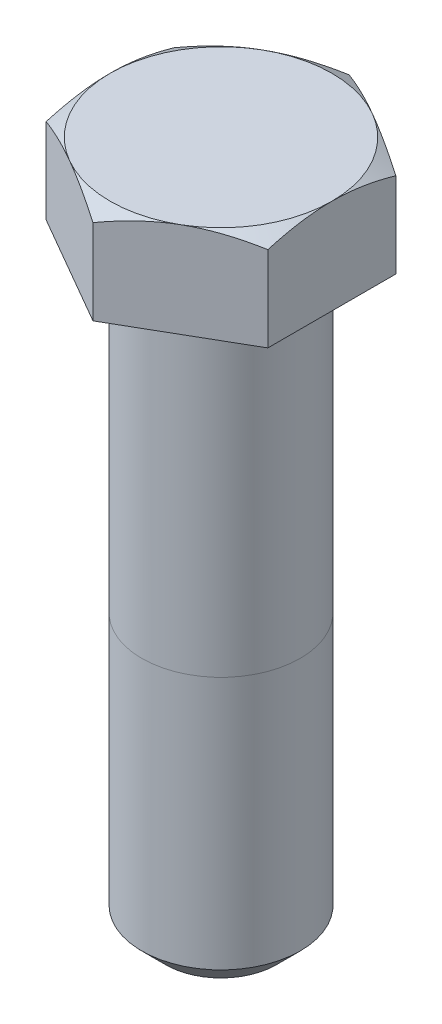
ISO-10303-21;
HEADER;
FILE_DESCRIPTION(('STEP AP214'),'2;1');
FILE_NAME('part.step','',(''),(''),'','','');
FILE_SCHEMA(('AUTOMOTIVE_DESIGN { 1 0 10303 214 1 1 1 1 }'));
ENDSEC;
DATA;
#1=APPLICATION_CONTEXT('core data for automotive mechanical design processes');
#2=APPLICATION_PROTOCOL_DEFINITION('international standard','automotive_design',2000,#1);
#3=PRODUCT_CONTEXT('',#1,'mechanical');
#4=PRODUCT('Part','Part','',(#3));
#5=PRODUCT_RELATED_PRODUCT_CATEGORY('part','',(#4));
#6=PRODUCT_DEFINITION_FORMATION('','',#4);
#7=PRODUCT_DEFINITION_CONTEXT('part definition',#1,'design');
#8=PRODUCT_DEFINITION('design','',#6,#7);
#9=PRODUCT_DEFINITION_SHAPE('','',#8);
#10=(LENGTH_UNIT() NAMED_UNIT(*) SI_UNIT(.MILLI.,.METRE.));
#11=(NAMED_UNIT(*) PLANE_ANGLE_UNIT() SI_UNIT($,.RADIAN.));
#12=(NAMED_UNIT(*) SI_UNIT($,.STERADIAN.) SOLID_ANGLE_UNIT());
#13=UNCERTAINTY_MEASURE_WITH_UNIT(LENGTH_MEASURE(1.E-05),#10,'distance_accuracy_value','');
#14=(GEOMETRIC_REPRESENTATION_CONTEXT(3) GLOBAL_UNCERTAINTY_ASSIGNED_CONTEXT((#13)) GLOBAL_UNIT_ASSIGNED_CONTEXT((#10,
#11,#12)) REPRESENTATION_CONTEXT('',''));
#15=CARTESIAN_POINT('',(0.,0.,0.));
#16=DIRECTION('',(0.,0.,1.));
#17=DIRECTION('',(1.,0.,0.));
#18=AXIS2_PLACEMENT_3D('',#15,#16,#17);
#19=CARTESIAN_POINT('',(0.,-75.,0.));
#20=DIRECTION('',(0.,1.,0.));
#21=DIRECTION('',(0.,0.,1.));
#22=AXIS2_PLACEMENT_3D('',#19,#20,#21);
#23=CYLINDRICAL_SURFACE('',#22,10.);
#24=CARTESIAN_POINT('',(0.,-72.,0.));
#25=DIRECTION('',(0.,-1.,0.));
#26=DIRECTION('',(0.,0.,-1.));
#27=AXIS2_PLACEMENT_3D('',#24,#25,#26);
#28=CIRCLE('',#27,10.);
#29=CARTESIAN_POINT('',(0.,-72.,-10.));
#30=VERTEX_POINT('',#29);
#31=EDGE_CURVE('E272',#30,#30,#28,.F.);
#32=ORIENTED_EDGE('',*,*,#31,.T.);
#33=EDGE_LOOP('',(#32));
#34=FACE_BOUND('',#33,.T.);
#35=CARTESIAN_POINT('',(0.,-40.,0.));
#36=DIRECTION('',(0.,1.,0.));
#37=DIRECTION('',(0.,0.,1.));
#38=AXIS2_PLACEMENT_3D('',#35,#36,#37);
#39=CIRCLE('',#38,10.);
#40=CARTESIAN_POINT('',(10.,-40.,0.));
#41=VERTEX_POINT('',#40);
#42=CARTESIAN_POINT('',(-10.,-40.,0.));
#43=VERTEX_POINT('',#42);
#44=EDGE_CURVE('E12',#41,#43,#39,.T.);
#45=ORIENTED_EDGE('',*,*,#44,.F.);
#46=EDGE_CURVE('E62',#43,#41,#39,.T.);
#47=ORIENTED_EDGE('',*,*,#46,.F.);
#48=EDGE_LOOP('',(#45,#47));
#49=FACE_BOUND('',#48,.T.);
#50=ADVANCED_FACE('F57',(#34,#49),#23,.T.);
#51=CARTESIAN_POINT('',(-13.9999999999999,12.,8.08290376865491));
#52=DIRECTION('',(0.499999999999995,0.,-0.866025403784441));
#53=DIRECTION('',(-0.866025403784441,0.,-0.499999999999995));
#54=AXIS2_PLACEMENT_3D('',#51,#52,#53);
#55=PLANE('',#54);
#56=CARTESIAN_POINT('',(-14.0001999999999,10.7495037679405,8.08278829860107));
#57=CARTESIAN_POINT('',(-13.692485390418,10.8520687355186,8.26044741127677));
#58=CARTESIAN_POINT('',(-13.3835705284392,10.9499795109551,8.43879948999691));
#59=CARTESIAN_POINT('',(-12.7632636692858,11.1351989694353,8.79693382210926));
#60=CARTESIAN_POINT('',(-12.4518708930621,11.2225041654761,8.97671652528571));
#61=CARTESIAN_POINT('',(-11.8260063991706,11.3853389062415,9.33805955931021));
#62=CARTESIAN_POINT('',(-11.5115292047328,11.4608405894043,9.5196230521729));
#63=CARTESIAN_POINT('',(-10.8803895759988,11.5984470625897,9.88401168671867));
#64=CARTESIAN_POINT('',(-10.5637272674324,11.6605526168897,10.0668367558117));
#65=CARTESIAN_POINT('',(-9.93633151674906,11.7687252680104,10.4290638613571));
#66=CARTESIAN_POINT('',(-9.6256446532553,11.81515039644,10.6084390056289));
#67=CARTESIAN_POINT('',(-9.00284729327501,11.8929951265451,10.9680112290642));
#68=CARTESIAN_POINT('',(-8.69073676950305,11.9244144393938,11.1482083239808));
#69=CARTESIAN_POINT('',(-8.0659914147665,11.9714542186344,11.5089052227129));
#70=CARTESIAN_POINT('',(-7.75335765114491,11.9870934589966,11.6894044102976));
#71=CARTESIAN_POINT('',(-7.12780152662083,12.0022367596143,12.0505694071848));
#72=CARTESIAN_POINT('',(-6.8148791749344,12.0017413184259,12.2312352111664));
#73=CARTESIAN_POINT('',(-6.22987230119091,11.9857422399056,12.5689890872));
#74=CARTESIAN_POINT('',(-5.95774609067852,11.9721901053227,12.7261012280929));
#75=CARTESIAN_POINT('',(-5.41411962233179,11.9331392398875,13.0399641159314));
#76=CARTESIAN_POINT('',(-5.14261941013841,11.9076396640127,13.1967148365263));
#77=CARTESIAN_POINT('',(-4.60039240839658,11.8451385190432,13.5097697419439));
#78=CARTESIAN_POINT('',(-4.32966644468913,11.8081274502385,13.666073449967));
#79=CARTESIAN_POINT('',(-3.78948373337585,11.7232526731859,13.9779480837553));
#80=CARTESIAN_POINT('',(-3.52002707332621,11.6753882271492,14.1335189589699));
#81=CARTESIAN_POINT('',(-2.70207638818779,11.514304872236,14.6057630072184));
#82=CARTESIAN_POINT('',(-2.15595101855748,11.3850242516312,14.9210686363857));
#83=CARTESIAN_POINT('',(-1.07184369066129,11.0916100987947,15.546978293977));
#84=CARTESIAN_POINT('',(-0.533847852112646,10.9275454762133,15.857590336186));
#85=CARTESIAN_POINT('',(0.000199999999999706,10.7495037679405,16.1659230073633));
#86=B_SPLINE_CURVE_WITH_KNOTS('',3,(#56,#57,#58,#59,#60,#61,#62,#63,#64,#65,#66,#67,#68,#69,#70,
#71,#72,#73,#74,#75,#76,#77,#78,#79,#80,#81,#82,#83,#84,#85),.UNSPECIFIED.,.F.,.F.,(4,2,2,2,2,2,
2,2,2,2,2,2,2,2,4),(0.,1.10950436744395,2.21937254652006,3.33182219257024,4.44420835421648,
5.52913815688044,6.61408884107339,7.69774720328184,8.7813720808532,9.72469383358148,
10.6680823159393,11.6122513923123,12.5564846704802,14.4864746839189,16.4126763879158),.UNSPECIFIED.);
#87=CARTESIAN_POINT('',(-13.9999999999999,10.7495704353215,8.08290376865495));
#88=VERTEX_POINT('',#87);
#89=CARTESIAN_POINT('',(-6.99999999999994,12.,12.1243556529822));
#90=VERTEX_POINT('',#89);
#91=EDGE_CURVE('E146',#88,#90,#86,.T.);
#92=ORIENTED_EDGE('',*,*,#91,.F.);
#93=DIRECTION('',(0.,-1.,0.));
#94=VECTOR('',#93,1.);
#95=CARTESIAN_POINT('',(-13.9999999999999,12.,8.08290376865491));
#96=LINE('',#95,#94);
#97=CARTESIAN_POINT('',(-13.9999999999999,0.,8.08290376865491));
#98=VERTEX_POINT('',#97);
#99=EDGE_CURVE('E291',#88,#98,#96,.T.);
#100=ORIENTED_EDGE('',*,*,#99,.T.);
#101=DIRECTION('',(0.866025403784441,0.,0.499999999999995));
#102=VECTOR('',#101,1.);
#103=CARTESIAN_POINT('',(-13.9999999999999,0.,8.08290376865491));
#104=LINE('',#103,#102);
#105=CARTESIAN_POINT('',(0.,0.,16.1658075373095));
#106=VERTEX_POINT('',#105);
#107=EDGE_CURVE('E154',#98,#106,#104,.T.);
#108=ORIENTED_EDGE('',*,*,#107,.T.);
#109=DIRECTION('',(0.,-1.,0.));
#110=VECTOR('',#109,1.);
#111=CARTESIAN_POINT('',(0.,12.,16.1658075373095));
#112=LINE('',#111,#110);
#113=CARTESIAN_POINT('',(0.,10.7495704353215,16.1658075373095));
#114=VERTEX_POINT('',#113);
#115=EDGE_CURVE('E159',#114,#106,#112,.T.);
#116=ORIENTED_EDGE('',*,*,#115,.F.);
#117=EDGE_CURVE('E131',#90,#114,#86,.T.);
#118=ORIENTED_EDGE('',*,*,#117,.F.);
#119=EDGE_LOOP('',(#92,#100,#108,#116,#118));
#120=FACE_BOUND('',#119,.T.);
#121=ADVANCED_FACE('F158',(#120),#55,.F.);
#122=CARTESIAN_POINT('',(0.,12.,16.1658075373095));
#123=DIRECTION('',(-0.500000000000001,0.,-0.866025403784438));
#124=DIRECTION('',(-0.866025403784438,0.,0.500000000000001));
#125=AXIS2_PLACEMENT_3D('',#122,#123,#124);
#126=PLANE('',#125);
#127=CARTESIAN_POINT('',(-0.000200000000000241,10.7495037679405,16.1659230073633));
#128=CARTESIAN_POINT('',(0.307514609581919,10.8520687355186,15.9882638946876));
#129=CARTESIAN_POINT('',(0.616429471560717,10.9499795109551,15.8099118159675));
#130=CARTESIAN_POINT('',(1.23673633071406,11.1351989694353,15.4517774838551));
#131=CARTESIAN_POINT('',(1.54812910693775,11.2225041654761,15.2719947806787));
#132=CARTESIAN_POINT('',(2.17399360082929,11.3853389062415,14.9106517466542));
#133=CARTESIAN_POINT('',(2.48847079526713,11.4608405894043,14.7290882537915));
#134=CARTESIAN_POINT('',(3.11961042400106,11.5984470625897,14.3646996192457));
#135=CARTESIAN_POINT('',(3.43627273256745,11.6605526168897,14.1818745501527));
#136=CARTESIAN_POINT('',(4.06366848325081,11.7687252680104,13.8196474446072));
#137=CARTESIAN_POINT('',(4.37435534674457,11.81515039644,13.6402723003354));
#138=CARTESIAN_POINT('',(4.99715270672486,11.8929951265452,13.2807000769002));
#139=CARTESIAN_POINT('',(5.30926323049681,11.9244144393938,13.1005029819836));
#140=CARTESIAN_POINT('',(5.93400858523335,11.9714542186344,12.7398060832515));
#141=CARTESIAN_POINT('',(6.24664234885495,11.9870934589967,12.5593068956668));
#142=CARTESIAN_POINT('',(6.87219847337902,12.0022367596144,12.1981418987796));
#143=CARTESIAN_POINT('',(7.18512082506545,12.0017413184259,12.017476094798));
#144=CARTESIAN_POINT('',(7.77012769880895,11.9857422399056,11.6797222187644));
#145=CARTESIAN_POINT('',(8.04225390932134,11.9721901053228,11.5226100778715));
#146=CARTESIAN_POINT('',(8.58588037766809,11.9331392398875,11.2087471900329));
#147=CARTESIAN_POINT('',(8.85738058986147,11.9076396640127,11.051996469438));
#148=CARTESIAN_POINT('',(9.39960759160331,11.8451385190433,10.7389415640205));
#149=CARTESIAN_POINT('',(9.67033355531078,11.8081274502385,10.5826378559973));
#150=CARTESIAN_POINT('',(10.2105162666241,11.7232526731859,10.270763222209));
#151=CARTESIAN_POINT('',(10.4799729266737,11.6753882271492,10.1151923469944));
#152=CARTESIAN_POINT('',(11.2979236118121,11.5143048722361,9.64294829874591));
#153=CARTESIAN_POINT('',(11.8440489814425,11.3850242516312,9.32764266957856));
#154=CARTESIAN_POINT('',(12.9281563093387,11.0916100987947,8.70173301198723));
#155=CARTESIAN_POINT('',(13.4661521478873,10.9275454762133,8.39112096977826));
#156=CARTESIAN_POINT('',(14.0002,10.7495037679405,8.08278829860088));
#157=B_SPLINE_CURVE_WITH_KNOTS('',3,(#127,#128,#129,#130,#131,#132,#133,#134,#135,#136,#137,
#138,#139,#140,#141,#142,#143,#144,#145,#146,#147,#148,#149,#150,#151,#152,#153,#154,#155,#156),
.UNSPECIFIED.,.F.,.F.,(4,2,2,2,2,2,2,2,2,2,2,2,2,2,4),(0.,1.10950436744395,2.21937254652007,
3.33182219257024,4.44420835421648,5.52913815688044,6.61408884107339,7.69774720328184,
8.7813720808532,9.72469383358151,10.6680823159393,11.6122513923123,12.5564846704803,
14.4864746839191,16.412676387916),.UNSPECIFIED.);
#158=CARTESIAN_POINT('',(7.,12.,12.1243556529821));
#159=VERTEX_POINT('',#158);
#160=EDGE_CURVE('E138',#114,#159,#157,.T.);
#161=ORIENTED_EDGE('',*,*,#160,.F.);
#162=ORIENTED_EDGE('',*,*,#115,.T.);
#163=DIRECTION('',(0.866025403784438,0.,-0.500000000000001));
#164=VECTOR('',#163,1.);
#165=CARTESIAN_POINT('',(0.,0.,16.1658075373095));
#166=LINE('',#165,#164);
#167=CARTESIAN_POINT('',(14.,0.,8.08290376865472));
#168=VERTEX_POINT('',#167);
#169=EDGE_CURVE('E315',#106,#168,#166,.T.);
#170=ORIENTED_EDGE('',*,*,#169,.T.);
#171=DIRECTION('',(0.,-1.,0.));
#172=VECTOR('',#171,1.);
#173=CARTESIAN_POINT('',(14.,12.,8.08290376865472));
#174=LINE('',#173,#172);
#175=CARTESIAN_POINT('',(14.,10.7495704353215,8.08290376865472));
#176=VERTEX_POINT('',#175);
#177=EDGE_CURVE('E279',#176,#168,#174,.T.);
#178=ORIENTED_EDGE('',*,*,#177,.F.);
#179=EDGE_CURVE('E228',#159,#176,#157,.T.);
#180=ORIENTED_EDGE('',*,*,#179,.F.);
#181=EDGE_LOOP('',(#161,#162,#170,#178,#180));
#182=FACE_BOUND('',#181,.T.);
#183=ADVANCED_FACE('F238',(#182),#126,.F.);
#184=CARTESIAN_POINT('',(14.,12.,8.08290376865472));
#185=DIRECTION('',(-1.,0.,0.));
#186=DIRECTION('',(0.,0.,1.));
#187=AXIS2_PLACEMENT_3D('',#184,#185,#186);
#188=PLANE('',#187);
#189=CARTESIAN_POINT('',(14.0000000000001,2.03488379712646,27.949831389081));
#190=CARTESIAN_POINT('',(14.0000000000001,2.3702307611129,27.3001164004973));
#191=CARTESIAN_POINT('',(14.0000000000001,2.70379549218834,26.6494735941291));
#192=CARTESIAN_POINT('',(14.0000000000001,3.36647218065571,25.3458869305561));
#193=CARTESIAN_POINT('',(14.0000000000001,3.69558392686957,24.6929429660596));
#194=CARTESIAN_POINT('',(14.,4.34895509189268,23.3833263693377));
#195=CARTESIAN_POINT('',(14.,4.67320593445993,22.7266494511295));
#196=CARTESIAN_POINT('',(14.,5.31507219467514,21.4100681833431));
#197=CARTESIAN_POINT('',(14.,5.63268771517719,20.7501638839886));
#198=CARTESIAN_POINT('',(14.,6.27639782623189,19.3911793293609));
#199=CARTESIAN_POINT('',(14.,6.60204234665208,18.6918853351431));
#200=CARTESIAN_POINT('',(14.,7.24172776898746,17.2879557164244));
#201=CARTESIAN_POINT('',(14.,7.55576820136405,16.5833198771625));
#202=CARTESIAN_POINT('',(14.,8.16867739244117,15.167908774893));
#203=CARTESIAN_POINT('',(14.,8.46755427059982,14.4571370411742));
#204=CARTESIAN_POINT('',(14.,9.0457014864569,13.0276643302037));
#205=CARTESIAN_POINT('',(14.,9.32497372517716,12.3089641296014));
#206=CARTESIAN_POINT('',(14.,9.74482799506643,11.1682733850544));
#207=CARTESIAN_POINT('',(14.,9.89407430992691,10.7494723140834));
#208=CARTESIAN_POINT('',(14.,10.1823750926574,9.90838165932028));
#209=CARTESIAN_POINT('',(14.,10.3214300364788,9.48609223946525));
#210=CARTESIAN_POINT('',(14.,10.5875993619507,8.63766324499771));
#211=CARTESIAN_POINT('',(14.,10.7147115244667,8.21152297090495));
#212=CARTESIAN_POINT('',(14.,10.9549202016765,7.35528655812799));
#213=CARTESIAN_POINT('',(14.,11.0680167434795,6.92519042709694));
#214=CARTESIAN_POINT('',(14.,11.2758840721238,6.06946764015131));
#215=CARTESIAN_POINT('',(14.,11.3709699599945,5.64391804159867));
#216=CARTESIAN_POINT('',(14.,11.5432633944382,4.78922316200006));
#217=CARTESIAN_POINT('',(14.,11.6204724976303,4.36007819739459));
#218=CARTESIAN_POINT('',(14.,11.7548378818571,3.49882659547704));
#219=CARTESIAN_POINT('',(14.,11.8120030992674,3.06672136580302));
#220=CARTESIAN_POINT('',(14.,11.9044878213308,2.20016115354933));
#221=CARTESIAN_POINT('',(14.,11.939807634267,1.76570620421627));
#222=CARTESIAN_POINT('',(14.,11.987682552461,0.889268007055252));
#223=CARTESIAN_POINT('',(14.,11.9999034228828,0.447266252123531));
#224=CARTESIAN_POINT('',(14.,12.0000954352863,-0.436742387197322));
#225=CARTESIAN_POINT('',(14.,11.9880665525097,-0.878749271591231));
#226=CARTESIAN_POINT('',(14.,11.940219694343,-1.76157137210903));
#227=CARTESIAN_POINT('',(14.,11.9043956669626,-2.20238625641704));
#228=CARTESIAN_POINT('',(14.,11.8102676642431,-3.08159302766078));
#229=CARTESIAN_POINT('',(14.,11.7519631323143,-3.51998485433195));
#230=CARTESIAN_POINT('',(14.,11.6134038217897,-4.40241931971309));
#231=CARTESIAN_POINT('',(14.,11.5327256319502,-4.84639486245938));
#232=CARTESIAN_POINT('',(14.,11.3523584685403,-5.73047648575373));
#233=CARTESIAN_POINT('',(14.,11.2526676610607,-6.17058218873932));
#234=CARTESIAN_POINT('',(13.9999999999999,11.0367258826045,-7.046775034194));
#235=CARTESIAN_POINT('',(13.9999999999999,10.9204716039982,-7.48286135545225));
#236=CARTESIAN_POINT('',(13.9999999999999,10.6737593179844,-8.35097500652423));
#237=CARTESIAN_POINT('',(13.9999999999999,10.5433012422704,-8.78300231680721));
#238=CARTESIAN_POINT('',(13.9999999999999,10.2734644154146,-9.63319530104947));
#239=CARTESIAN_POINT('',(13.9999999999999,10.1343636924936,-10.0514496779824));
#240=CARTESIAN_POINT('',(13.9999999999999,9.8463273100482,-10.8845668621142));
#241=CARTESIAN_POINT('',(13.9999999999999,9.6973911974188,-11.2994295120695));
#242=CARTESIAN_POINT('',(13.9999999999999,9.39112136186723,-12.1261353881979));
#243=CARTESIAN_POINT('',(13.9999999999999,9.23378583131538,-12.537977942553));
#244=CARTESIAN_POINT('',(13.9999999999999,8.91198598962466,-13.3588542739791));
#245=CARTESIAN_POINT('',(13.9999999999999,8.74752178173895,-13.7678880916329));
#246=CARTESIAN_POINT('',(13.9999999999999,8.41230801263029,-14.5839202435863));
#247=CARTESIAN_POINT('',(13.9999999999999,8.24155139938862,-14.9909156752665));
#248=CARTESIAN_POINT('',(13.9999999999999,7.89479563942917,-15.8026699480745));
#249=CARTESIAN_POINT('',(13.9999999999999,7.71879640672675,-16.20742875239));
#250=CARTESIAN_POINT('',(13.9999999999999,7.18410896270166,-17.4186205811024));
#251=CARTESIAN_POINT('',(13.9999999999999,6.81868431848697,-18.222081485259));
#252=CARTESIAN_POINT('',(13.9999999999999,6.09600771684726,-19.7762175122286));
#253=CARTESIAN_POINT('',(13.9999999999999,5.73951424702887,-20.5272475672054));
#254=CARTESIAN_POINT('',(13.9999999999999,5.01722134933974,-22.0248444765253));
#255=CARTESIAN_POINT('',(13.9999999999999,4.65142159755788,-22.7714111743984));
#256=CARTESIAN_POINT('',(13.9999999999999,3.91377227930193,-24.2583278595973));
#257=CARTESIAN_POINT('',(13.9999999999999,3.54194800035152,-24.9986904161943));
#258=CARTESIAN_POINT('',(13.9999999999999,2.97985081028371,-26.1069781380863));
#259=CARTESIAN_POINT('',(13.9999999999999,2.79176632306057,-26.4760158168578));
#260=CARTESIAN_POINT('',(13.9999999999999,2.41427909262908,-27.2134142676696));
#261=CARTESIAN_POINT('',(13.9999999999999,2.22487635557734,-27.581775042861));
#262=CARTESIAN_POINT('',(13.9999999999999,2.03488379712646,-27.9498313890811));
#263=B_SPLINE_CURVE_WITH_KNOTS('',3,(#189,#190,#191,#192,#193,#194,#195,#196,#197,#198,#199,
#200,#201,#202,#203,#204,#205,#206,#207,#208,#209,#210,#211,#212,#213,#214,#215,#216,#217,#218,
#219,#220,#221,#222,#223,#224,#225,#226,#227,#228,#229,#230,#231,#232,#233,#234,#235,#236,#237,
#238,#239,#240,#241,#242,#243,#244,#245,#246,#247,#248,#249,#250,#251,#252,#253,#254,#255,#256,
#257,#258,#259,#260,#261,#262),.UNSPECIFIED.,.F.,.F.,(4,2,2,2,2,2,2,2,2,2,2,2,2,2,2,2,2,2,2,2,2,
2,2,2,2,2,2,2,2,2,2,2,2,2,2,2,4),(0.,2.19347176186133,4.38704718473205,6.5841211787642,
8.78116109065344,11.0952767189595,13.4094858814932,15.7224425113349,18.035174547799,
19.3688685705576,20.7025002681792,22.036379285016,23.3702557218224,24.678049280889,
25.9857289211005,27.2928248012449,28.5999022351851,29.9257520686343,31.2516032557344,
32.5777917852944,33.9040131517597,35.2572819955675,36.6106814383633,37.9643515270123,
39.3180281257887,40.6402225516445,41.9624779320168,43.2850190297715,44.6075409779794,
45.9315930896242,47.2556669291279,49.9034493909698,52.3974119375353,54.8914614071462,
57.3768884544876,58.6194969900369,59.8620997261259),.UNSPECIFIED.);
#264=CARTESIAN_POINT('',(14.,12.,0.));
#265=VERTEX_POINT('',#264);
#266=EDGE_CURVE('E229',#176,#265,#263,.T.);
#267=ORIENTED_EDGE('',*,*,#266,.F.);
#268=ORIENTED_EDGE('',*,*,#177,.T.);
#269=DIRECTION('',(0.,0.,-1.));
#270=VECTOR('',#269,1.);
#271=CARTESIAN_POINT('',(14.,0.,8.08290376865472));
#272=LINE('',#271,#270);
#273=CARTESIAN_POINT('',(13.9999999999999,0.,-8.08290376865481));
#274=VERTEX_POINT('',#273);
#275=EDGE_CURVE('E306',#168,#274,#272,.T.);
#276=ORIENTED_EDGE('',*,*,#275,.T.);
#277=DIRECTION('',(0.,-1.,0.));
#278=VECTOR('',#277,1.);
#279=CARTESIAN_POINT('',(13.9999999999999,12.,-8.08290376865481));
#280=LINE('',#279,#278);
#281=CARTESIAN_POINT('',(13.9999999999999,10.7495704353215,-8.08290376865481));
#282=VERTEX_POINT('',#281);
#283=EDGE_CURVE('E285',#282,#274,#280,.T.);
#284=ORIENTED_EDGE('',*,*,#283,.F.);
#285=EDGE_CURVE('E222',#265,#282,#263,.T.);
#286=ORIENTED_EDGE('',*,*,#285,.F.);
#287=EDGE_LOOP('',(#267,#268,#276,#284,#286));
#288=FACE_BOUND('',#287,.T.);
#289=ADVANCED_FACE('F237',(#288),#188,.F.);
#290=CARTESIAN_POINT('',(13.9999999999999,12.,-8.08290376865481));
#291=DIRECTION('',(-0.499999999999995,0.,0.866025403784441));
#292=DIRECTION('',(0.866025403784442,0.,0.499999999999995));
#293=AXIS2_PLACEMENT_3D('',#290,#291,#292);
#294=PLANE('',#293);
#295=CARTESIAN_POINT('',(14.0001999999999,10.7495037679405,-8.08278829860097));
#296=CARTESIAN_POINT('',(13.692485390418,10.8520687355186,-8.26044741127667));
#297=CARTESIAN_POINT('',(13.3835705284392,10.9499795109551,-8.43879948999681));
#298=CARTESIAN_POINT('',(12.7632636692859,11.1351989694353,-8.79693382210916));
#299=CARTESIAN_POINT('',(12.4518708930622,11.2225041654761,-8.97671652528561));
#300=CARTESIAN_POINT('',(11.8260063991706,11.3853389062415,-9.33805955931011));
#301=CARTESIAN_POINT('',(11.5115292047328,11.4608405894043,-9.5196230521728));
#302=CARTESIAN_POINT('',(10.8803895759989,11.5984470625897,-9.88401168671857));
#303=CARTESIAN_POINT('',(10.5637272674325,11.6605526168897,-10.0668367558116));
#304=CARTESIAN_POINT('',(9.93633151674912,11.7687252680104,-10.429063861357));
#305=CARTESIAN_POINT('',(9.62564465325536,11.81515039644,-10.6084390056288));
#306=CARTESIAN_POINT('',(9.00284729327507,11.8929951265452,-10.968011229064));
#307=CARTESIAN_POINT('',(8.69073676950311,11.9244144393938,-11.1482083239807));
#308=CARTESIAN_POINT('',(8.06599141476657,11.9714542186344,-11.5089052227128));
#309=CARTESIAN_POINT('',(7.75335765114497,11.9870934589967,-11.6894044102975));
#310=CARTESIAN_POINT('',(7.1278015266209,12.0022367596144,-12.0505694071847));
#311=CARTESIAN_POINT('',(6.81487917493447,12.0017413184259,-12.2312352111663));
#312=CARTESIAN_POINT('',(6.22987230119096,11.9857422399056,-12.5689890871999));
#313=CARTESIAN_POINT('',(5.95774609067857,11.9721901053228,-12.7261012280928));
#314=CARTESIAN_POINT('',(5.41411962233182,11.9331392398875,-13.0399641159314));
#315=CARTESIAN_POINT('',(5.14261941013844,11.9076396640127,-13.1967148365263));
#316=CARTESIAN_POINT('',(4.60039240839659,11.8451385190433,-13.5097697419438));
#317=CARTESIAN_POINT('',(4.32966644468913,11.8081274502385,-13.6660734499669));
#318=CARTESIAN_POINT('',(3.78948373337584,11.7232526731859,-13.9779480837552));
#319=CARTESIAN_POINT('',(3.52002707332619,11.6753882271492,-14.1335189589698));
#320=CARTESIAN_POINT('',(2.70207638818776,11.5143048722361,-14.6057630072183));
#321=CARTESIAN_POINT('',(2.15595101855743,11.3850242516312,-14.9210686363857));
#322=CARTESIAN_POINT('',(1.0718436906612,11.0916100987947,-15.546978293977));
#323=CARTESIAN_POINT('',(0.533847852112547,10.9275454762133,-15.857590336186));
#324=CARTESIAN_POINT('',(-0.000200000000112113,10.7495037679405,-16.1659230073633));
#325=B_SPLINE_CURVE_WITH_KNOTS('',3,(#295,#296,#297,#298,#299,#300,#301,#302,#303,#304,#305,
#306,#307,#308,#309,#310,#311,#312,#313,#314,#315,#316,#317,#318,#319,#320,#321,#322,#323,#324),
.UNSPECIFIED.,.F.,.F.,(4,2,2,2,2,2,2,2,2,2,2,2,2,2,4),(0.,1.10950436744395,2.21937254652007,
3.33182219257024,4.44420835421648,5.52913815688044,6.61408884107339,7.69774720328184,
8.7813720808532,9.7246938335815,10.6680823159393,11.6122513923123,12.5564846704803,
14.4864746839191,16.412676387916),.UNSPECIFIED.);
#326=CARTESIAN_POINT('',(6.99999999999991,12.,-12.1243556529822));
#327=VERTEX_POINT('',#326);
#328=EDGE_CURVE('E226',#282,#327,#325,.T.);
#329=ORIENTED_EDGE('',*,*,#328,.F.);
#330=ORIENTED_EDGE('',*,*,#283,.T.);
#331=DIRECTION('',(-0.866025403784442,0.,-0.499999999999995));
#332=VECTOR('',#331,1.);
#333=CARTESIAN_POINT('',(13.9999999999999,0.,-8.08290376865481));
#334=LINE('',#333,#332);
#335=CARTESIAN_POINT('',(-1.12885230687692E-13,0.,-16.1658075373095));
#336=VERTEX_POINT('',#335);
#337=EDGE_CURVE('E304',#274,#336,#334,.T.);
#338=ORIENTED_EDGE('',*,*,#337,.T.);
#339=DIRECTION('',(0.,-1.,0.));
#340=VECTOR('',#339,1.);
#341=CARTESIAN_POINT('',(-1.12885230687692E-13,12.,-16.1658075373095));
#342=LINE('',#341,#340);
#343=CARTESIAN_POINT('',(-1.12675639656375E-13,10.7495704353215,-16.1658075373095));
#344=VERTEX_POINT('',#343);
#345=EDGE_CURVE('E290',#344,#336,#342,.T.);
#346=ORIENTED_EDGE('',*,*,#345,.F.);
#347=EDGE_CURVE('E184',#327,#344,#325,.T.);
#348=ORIENTED_EDGE('',*,*,#347,.F.);
#349=EDGE_LOOP('',(#329,#330,#338,#346,#348));
#350=FACE_BOUND('',#349,.T.);
#351=ADVANCED_FACE('F239',(#350),#294,.F.);
#352=CARTESIAN_POINT('',(-1.12885230687692E-13,12.,-16.1658075373095));
#353=DIRECTION('',(0.500000000000007,0.,0.866025403784434));
#354=DIRECTION('',(0.866025403784435,0.,-0.500000000000007));
#355=AXIS2_PLACEMENT_3D('',#352,#353,#354);
#356=PLANE('',#355);
#357=CARTESIAN_POINT('',(0.000199999999887115,10.7495037679405,-16.1659230073633));
#358=CARTESIAN_POINT('',(-0.307514609582032,10.8520687355186,-15.9882638946876));
#359=CARTESIAN_POINT('',(-0.616429471560829,10.9499795109551,-15.8099118159675));
#360=CARTESIAN_POINT('',(-1.23673633071417,11.1351989694353,-15.4517774838551));
#361=CARTESIAN_POINT('',(-1.54812910693786,11.2225041654761,-15.2719947806787));
#362=CARTESIAN_POINT('',(-2.17399360082939,11.3853389062415,-14.9106517466542));
#363=CARTESIAN_POINT('',(-2.48847079526723,11.4608405894043,-14.7290882537915));
#364=CARTESIAN_POINT('',(-3.11961042400116,11.5984470625897,-14.3646996192457));
#365=CARTESIAN_POINT('',(-3.43627273256755,11.6605526168897,-14.1818745501527));
#366=CARTESIAN_POINT('',(-4.0636684832509,11.7687252680104,-13.8196474446072));
#367=CARTESIAN_POINT('',(-4.37435534674466,11.81515039644,-13.6402723003354));
#368=CARTESIAN_POINT('',(-4.99715270672495,11.8929951265452,-13.2807000769002));
#369=CARTESIAN_POINT('',(-5.3092632304969,11.9244144393938,-13.1005029819835));
#370=CARTESIAN_POINT('',(-5.93400858523344,11.9714542186344,-12.7398060832514));
#371=CARTESIAN_POINT('',(-6.24664234885504,11.9870934589967,-12.5593068956667));
#372=CARTESIAN_POINT('',(-6.87219847337911,12.0022367596144,-12.1981418987795));
#373=CARTESIAN_POINT('',(-7.18512082506553,12.0017413184259,-12.0174760947979));
#374=CARTESIAN_POINT('',(-7.77012769880903,11.9857422399056,-11.6797222187643));
#375=CARTESIAN_POINT('',(-8.04225390932142,11.9721901053228,-11.5226100778714));
#376=CARTESIAN_POINT('',(-8.58588037766817,11.9331392398875,-11.2087471900328));
#377=CARTESIAN_POINT('',(-8.85738058986155,11.9076396640127,-11.0519964694379));
#378=CARTESIAN_POINT('',(-9.39960759160339,11.8451385190433,-10.7389415640204));
#379=CARTESIAN_POINT('',(-9.67033355531085,11.8081274502385,-10.5826378559973));
#380=CARTESIAN_POINT('',(-10.2105162666241,11.7232526731859,-10.270763222209));
#381=CARTESIAN_POINT('',(-10.4799729266738,11.6753882271492,-10.1151923469943));
#382=CARTESIAN_POINT('',(-11.2979236118122,11.5143048722361,-9.64294829874583));
#383=CARTESIAN_POINT('',(-11.8440489814425,11.3850242516312,-9.32764266957847));
#384=CARTESIAN_POINT('',(-12.9281563093387,11.0916100987947,-8.70173301198714));
#385=CARTESIAN_POINT('',(-13.4661521478874,10.9275454762133,-8.39112096977817));
#386=CARTESIAN_POINT('',(-14.0002000000001,10.7495037679405,-8.08278829860078));
#387=B_SPLINE_CURVE_WITH_KNOTS('',3,(#357,#358,#359,#360,#361,#362,#363,#364,#365,#366,#367,
#368,#369,#370,#371,#372,#373,#374,#375,#376,#377,#378,#379,#380,#381,#382,#383,#384,#385,#386),
.UNSPECIFIED.,.F.,.F.,(4,2,2,2,2,2,2,2,2,2,2,2,2,2,4),(0.,1.10950436744395,2.21937254652007,
3.33182219257024,4.44420835421648,5.52913815688044,6.61408884107339,7.69774720328184,
8.78137208085319,9.7246938335815,10.6680823159393,11.6122513923123,12.5564846704803,
14.4864746839191,16.412676387916),.UNSPECIFIED.);
#388=CARTESIAN_POINT('',(-7.00000000000008,12.,-12.1243556529821));
#389=VERTEX_POINT('',#388);
#390=EDGE_CURVE('E181',#344,#389,#387,.T.);
#391=ORIENTED_EDGE('',*,*,#390,.F.);
#392=ORIENTED_EDGE('',*,*,#345,.T.);
#393=DIRECTION('',(-0.866025403784435,0.,0.500000000000007));
#394=VECTOR('',#393,1.);
#395=CARTESIAN_POINT('',(-1.12885230687692E-13,0.,-16.1658075373095));
#396=LINE('',#395,#394);
#397=CARTESIAN_POINT('',(-14.0000000000001,0.,-8.08290376865462));
#398=VERTEX_POINT('',#397);
#399=EDGE_CURVE('E298',#336,#398,#396,.T.);
#400=ORIENTED_EDGE('',*,*,#399,.T.);
#401=DIRECTION('',(0.,-1.,0.));
#402=VECTOR('',#401,1.);
#403=CARTESIAN_POINT('',(-14.0000000000001,12.,-8.08290376865462));
#404=LINE('',#403,#402);
#405=CARTESIAN_POINT('',(-14.0000000000001,10.7495704353215,-8.08290376865462));
#406=VERTEX_POINT('',#405);
#407=EDGE_CURVE('E287',#406,#398,#404,.T.);
#408=ORIENTED_EDGE('',*,*,#407,.F.);
#409=EDGE_CURVE('E175',#389,#406,#387,.T.);
#410=ORIENTED_EDGE('',*,*,#409,.F.);
#411=EDGE_LOOP('',(#391,#392,#400,#408,#410));
#412=FACE_BOUND('',#411,.T.);
#413=ADVANCED_FACE('F193',(#412),#356,.F.);
#414=CARTESIAN_POINT('',(-14.0000000000001,12.,-8.08290376865462));
#415=DIRECTION('',(1.,0.,0.));
#416=DIRECTION('',(0.,0.,-1.));
#417=AXIS2_PLACEMENT_3D('',#414,#415,#416);
#418=PLANE('',#417);
#419=CARTESIAN_POINT('',(-14.0000000000003,2.03488379712646,-27.9498313890809));
#420=CARTESIAN_POINT('',(-14.0000000000003,2.3702307611129,-27.3001164004972));
#421=CARTESIAN_POINT('',(-14.0000000000002,2.70379549218834,-26.649473594129));
#422=CARTESIAN_POINT('',(-14.0000000000002,3.36647218065571,-25.345886930556));
#423=CARTESIAN_POINT('',(-14.0000000000002,3.69558392686957,-24.6929429660595));
#424=CARTESIAN_POINT('',(-14.0000000000002,4.34895509189268,-23.3833263693376));
#425=CARTESIAN_POINT('',(-14.0000000000002,4.67320593445993,-22.7266494511294));
#426=CARTESIAN_POINT('',(-14.0000000000002,5.31507219467514,-21.410068183343));
#427=CARTESIAN_POINT('',(-14.0000000000002,5.63268771517719,-20.7501638839885));
#428=CARTESIAN_POINT('',(-14.0000000000002,6.27639782623189,-19.3911793293608));
#429=CARTESIAN_POINT('',(-14.0000000000002,6.60204234665208,-18.6918853351431));
#430=CARTESIAN_POINT('',(-14.0000000000001,7.24172776898746,-17.2879557164243));
#431=CARTESIAN_POINT('',(-14.0000000000001,7.55576820136405,-16.5833198771624));
#432=CARTESIAN_POINT('',(-14.0000000000001,8.16867739244117,-15.1679087748929));
#433=CARTESIAN_POINT('',(-14.0000000000001,8.46755427059983,-14.4571370411741));
#434=CARTESIAN_POINT('',(-14.0000000000001,9.0457014864569,-13.0276643302036));
#435=CARTESIAN_POINT('',(-14.0000000000001,9.32497372517716,-12.3089641296013));
#436=CARTESIAN_POINT('',(-14.0000000000001,9.74482799506643,-11.1682733850543));
#437=CARTESIAN_POINT('',(-14.0000000000001,9.89407430992691,-10.7494723140833));
#438=CARTESIAN_POINT('',(-14.0000000000001,10.1823750926574,-9.90838165932018));
#439=CARTESIAN_POINT('',(-14.0000000000001,10.3214300364788,-9.48609223946516));
#440=CARTESIAN_POINT('',(-14.0000000000001,10.5875993619507,-8.63766324499761));
#441=CARTESIAN_POINT('',(-14.0000000000001,10.7147115244667,-8.21152297090485));
#442=CARTESIAN_POINT('',(-14.,10.9549202016765,-7.35528655812789));
#443=CARTESIAN_POINT('',(-14.,11.0680167434795,-6.92519042709684));
#444=CARTESIAN_POINT('',(-14.,11.2758840721238,-6.06946764015121));
#445=CARTESIAN_POINT('',(-14.,11.3709699599945,-5.64391804159857));
#446=CARTESIAN_POINT('',(-14.,11.5432633944382,-4.78922316199996));
#447=CARTESIAN_POINT('',(-14.,11.6204724976303,-4.36007819739449));
#448=CARTESIAN_POINT('',(-14.,11.7548378818571,-3.49882659547695));
#449=CARTESIAN_POINT('',(-14.,11.8120030992674,-3.06672136580293));
#450=CARTESIAN_POINT('',(-14.,11.9044878213308,-2.20016115354924));
#451=CARTESIAN_POINT('',(-14.,11.939807634267,-1.76570620421617));
#452=CARTESIAN_POINT('',(-14.,11.987682552461,-0.889268007055155));
#453=CARTESIAN_POINT('',(-14.,11.9999034228828,-0.447266252123435));
#454=CARTESIAN_POINT('',(-14.,12.0000954352863,0.436742387197419));
#455=CARTESIAN_POINT('',(-14.,11.9880665525097,0.878749271591329));
#456=CARTESIAN_POINT('',(-14.,11.940219694343,1.76157137210913));
#457=CARTESIAN_POINT('',(-13.9999999999999,11.9043956669626,2.20238625641714));
#458=CARTESIAN_POINT('',(-13.9999999999999,11.8102676642431,3.08159302766087));
#459=CARTESIAN_POINT('',(-13.9999999999999,11.7519631323144,3.51998485433205));
#460=CARTESIAN_POINT('',(-13.9999999999999,11.6134038217897,4.40241931971319));
#461=CARTESIAN_POINT('',(-13.9999999999999,11.5327256319502,4.84639486245947));
#462=CARTESIAN_POINT('',(-13.9999999999999,11.3523584685403,5.73047648575383));
#463=CARTESIAN_POINT('',(-13.9999999999999,11.2526676610607,6.17058218873942));
#464=CARTESIAN_POINT('',(-13.9999999999999,11.0367258826045,7.0467750341941));
#465=CARTESIAN_POINT('',(-13.9999999999999,10.9204716039982,7.48286135545235));
#466=CARTESIAN_POINT('',(-13.9999999999999,10.6737593179844,8.35097500652433));
#467=CARTESIAN_POINT('',(-13.9999999999999,10.5433012422704,8.7830023168073));
#468=CARTESIAN_POINT('',(-13.9999999999999,10.2734644154146,9.63319530104957));
#469=CARTESIAN_POINT('',(-13.9999999999999,10.1343636924936,10.0514496779825));
#470=CARTESIAN_POINT('',(-13.9999999999999,9.84632731004821,10.8845668621143));
#471=CARTESIAN_POINT('',(-13.9999999999999,9.6973911974188,11.2994295120696));
#472=CARTESIAN_POINT('',(-13.9999999999998,9.39112136186724,12.126135388198));
#473=CARTESIAN_POINT('',(-13.9999999999998,9.23378583131538,12.5379779425531));
#474=CARTESIAN_POINT('',(-13.9999999999998,8.91198598962466,13.3588542739791));
#475=CARTESIAN_POINT('',(-13.9999999999998,8.74752178173895,13.767888091633));
#476=CARTESIAN_POINT('',(-13.9999999999998,8.41230801263029,14.5839202435864));
#477=CARTESIAN_POINT('',(-13.9999999999998,8.24155139938862,14.9909156752666));
#478=CARTESIAN_POINT('',(-13.9999999999998,7.89479563942917,15.8026699480745));
#479=CARTESIAN_POINT('',(-13.9999999999998,7.71879640672675,16.2074287523901));
#480=CARTESIAN_POINT('',(-13.9999999999998,7.18410896270166,17.4186205811025));
#481=CARTESIAN_POINT('',(-13.9999999999998,6.81868431848697,18.2220814852591));
#482=CARTESIAN_POINT('',(-13.9999999999998,6.09600771684726,19.7762175122287));
#483=CARTESIAN_POINT('',(-13.9999999999998,5.73951424702887,20.5272475672055));
#484=CARTESIAN_POINT('',(-13.9999999999997,5.01722134933974,22.0248444765254));
#485=CARTESIAN_POINT('',(-13.9999999999997,4.65142159755788,22.7714111743985));
#486=CARTESIAN_POINT('',(-13.9999999999997,3.91377227930193,24.2583278595974));
#487=CARTESIAN_POINT('',(-13.9999999999997,3.54194800035152,24.9986904161944));
#488=CARTESIAN_POINT('',(-13.9999999999997,2.97985081028371,26.1069781380864));
#489=CARTESIAN_POINT('',(-13.9999999999997,2.79176632306057,26.4760158168579));
#490=CARTESIAN_POINT('',(-13.9999999999997,2.41427909262908,27.2134142676697));
#491=CARTESIAN_POINT('',(-13.9999999999997,2.22487635557734,27.5817750428611));
#492=CARTESIAN_POINT('',(-13.9999999999997,2.03488379712646,27.9498313890812));
#493=B_SPLINE_CURVE_WITH_KNOTS('',3,(#419,#420,#421,#422,#423,#424,#425,#426,#427,#428,#429,
#430,#431,#432,#433,#434,#435,#436,#437,#438,#439,#440,#441,#442,#443,#444,#445,#446,#447,#448,
#449,#450,#451,#452,#453,#454,#455,#456,#457,#458,#459,#460,#461,#462,#463,#464,#465,#466,#467,
#468,#469,#470,#471,#472,#473,#474,#475,#476,#477,#478,#479,#480,#481,#482,#483,#484,#485,#486,
#487,#488,#489,#490,#491,#492),.UNSPECIFIED.,.F.,.F.,(4,2,2,2,2,2,2,2,2,2,2,2,2,2,2,2,2,2,2,2,2,
2,2,2,2,2,2,2,2,2,2,2,2,2,2,2,4),(0.,2.19347176186133,4.38704718473205,6.58412117876421,
8.78116109065344,11.0952767189595,13.4094858814932,15.7224425113349,18.035174547799,
19.3688685705576,20.7025002681792,22.0363792850161,23.3702557218224,24.678049280889,
25.9857289211005,27.2928248012449,28.5999022351851,29.9257520686343,31.2516032557344,
32.5777917852944,33.9040131517597,35.2572819955675,36.6106814383633,37.9643515270123,
39.3180281257887,40.6402225516445,41.9624779320168,43.2850190297715,44.6075409779794,
45.9315930896242,47.2556669291279,49.9034493909698,52.3974119375353,54.8914614071462,
57.3768884544876,58.6194969900369,59.8620997261258),.UNSPECIFIED.);
#494=CARTESIAN_POINT('',(-14.,12.,1.45724516077504E-13));
#495=VERTEX_POINT('',#494);
#496=EDGE_CURVE('E267',#406,#495,#493,.T.);
#497=ORIENTED_EDGE('',*,*,#496,.F.);
#498=ORIENTED_EDGE('',*,*,#407,.T.);
#499=DIRECTION('',(0.,0.,1.));
#500=VECTOR('',#499,1.);
#501=CARTESIAN_POINT('',(-14.0000000000001,0.,-8.08290376865462));
#502=LINE('',#501,#500);
#503=EDGE_CURVE('E297',#398,#98,#502,.T.);
#504=ORIENTED_EDGE('',*,*,#503,.T.);
#505=ORIENTED_EDGE('',*,*,#99,.F.);
#506=EDGE_CURVE('E151',#495,#88,#493,.T.);
#507=ORIENTED_EDGE('',*,*,#506,.F.);
#508=EDGE_LOOP('',(#497,#498,#504,#505,#507));
#509=FACE_BOUND('',#508,.T.);
#510=ADVANCED_FACE('F355',(#509),#418,.F.);
#511=CARTESIAN_POINT('',(0.,0.,0.));
#512=DIRECTION('',(0.,1.,0.));
#513=DIRECTION('',(0.,0.,1.));
#514=AXIS2_PLACEMENT_3D('',#511,#512,#513);
#515=PLANE('',#514);
#516=CARTESIAN_POINT('',(0.,0.,0.));
#517=DIRECTION('',(0.,-1.,0.));
#518=DIRECTION('',(0.,0.,-1.));
#519=AXIS2_PLACEMENT_3D('',#516,#517,#518);
#520=CIRCLE('',#519,10.);
#521=CARTESIAN_POINT('',(0.,0.,-10.));
#522=VERTEX_POINT('',#521);
#523=EDGE_CURVE('E171',#522,#522,#520,.T.);
#524=ORIENTED_EDGE('',*,*,#523,.F.);
#525=EDGE_LOOP('',(#524));
#526=FACE_BOUND('',#525,.T.);
#527=ORIENTED_EDGE('',*,*,#107,.F.);
#528=ORIENTED_EDGE('',*,*,#503,.F.);
#529=ORIENTED_EDGE('',*,*,#399,.F.);
#530=ORIENTED_EDGE('',*,*,#337,.F.);
#531=ORIENTED_EDGE('',*,*,#275,.F.);
#532=ORIENTED_EDGE('',*,*,#169,.F.);
#533=EDGE_LOOP('',(#527,#528,#529,#530,#531,#532));
#534=FACE_BOUND('',#533,.T.);
#535=ADVANCED_FACE('F200',(#526,#534),#515,.F.);
#536=CARTESIAN_POINT('',(0.,12.,0.));
#537=DIRECTION('',(0.,-1.,0.));
#538=DIRECTION('',(0.,0.,1.));
#539=AXIS2_PLACEMENT_3D('',#536,#537,#538);
#540=CONICAL_SURFACE('',#539,14.,1.0471975511966);
#541=ORIENTED_EDGE('',*,*,#91,.T.);
#542=CARTESIAN_POINT('',(0.,12.,0.));
#543=DIRECTION('',(0.,1.,0.));
#544=DIRECTION('',(0.,0.,1.));
#545=AXIS2_PLACEMENT_3D('',#542,#543,#544);
#546=CIRCLE('',#545,14.);
#547=EDGE_CURVE('E142',#495,#90,#546,.T.);
#548=ORIENTED_EDGE('',*,*,#547,.F.);
#549=ORIENTED_EDGE('',*,*,#506,.T.);
#550=EDGE_LOOP('',(#541,#548,#549));
#551=FACE_BOUND('',#550,.T.);
#552=ADVANCED_FACE('F149',(#551),#540,.T.);
#553=ORIENTED_EDGE('',*,*,#409,.T.);
#554=ORIENTED_EDGE('',*,*,#496,.T.);
#555=EDGE_CURVE('E164',#389,#495,#546,.T.);
#556=ORIENTED_EDGE('',*,*,#555,.F.);
#557=EDGE_LOOP('',(#553,#554,#556));
#558=FACE_BOUND('',#557,.T.);
#559=ADVANCED_FACE('F196',(#558),#540,.T.);
#560=ORIENTED_EDGE('',*,*,#347,.T.);
#561=ORIENTED_EDGE('',*,*,#390,.T.);
#562=EDGE_CURVE('E169',#327,#389,#546,.T.);
#563=ORIENTED_EDGE('',*,*,#562,.F.);
#564=EDGE_LOOP('',(#560,#561,#563));
#565=FACE_BOUND('',#564,.T.);
#566=ADVANCED_FACE('F350',(#565),#540,.T.);
#567=ORIENTED_EDGE('',*,*,#285,.T.);
#568=ORIENTED_EDGE('',*,*,#328,.T.);
#569=EDGE_CURVE('E174',#265,#327,#546,.T.);
#570=ORIENTED_EDGE('',*,*,#569,.F.);
#571=EDGE_LOOP('',(#567,#568,#570));
#572=FACE_BOUND('',#571,.T.);
#573=ADVANCED_FACE('F345',(#572),#540,.T.);
#574=ORIENTED_EDGE('',*,*,#179,.T.);
#575=ORIENTED_EDGE('',*,*,#266,.T.);
#576=EDGE_CURVE('E145',#159,#265,#546,.T.);
#577=ORIENTED_EDGE('',*,*,#576,.F.);
#578=EDGE_LOOP('',(#574,#575,#577));
#579=FACE_BOUND('',#578,.T.);
#580=ADVANCED_FACE('F329',(#579),#540,.T.);
#581=ORIENTED_EDGE('',*,*,#117,.T.);
#582=ORIENTED_EDGE('',*,*,#160,.T.);
#583=EDGE_CURVE('E128',#90,#159,#546,.T.);
#584=ORIENTED_EDGE('',*,*,#583,.F.);
#585=EDGE_LOOP('',(#581,#582,#584));
#586=FACE_BOUND('',#585,.T.);
#587=ADVANCED_FACE('F135',(#586),#540,.T.);
#588=CARTESIAN_POINT('',(0.,12.,0.));
#589=DIRECTION('',(0.,1.,0.));
#590=DIRECTION('',(0.,0.,1.));
#591=AXIS2_PLACEMENT_3D('',#588,#589,#590);
#592=PLANE('',#591);
#593=ORIENTED_EDGE('',*,*,#583,.T.);
#594=ORIENTED_EDGE('',*,*,#576,.T.);
#595=ORIENTED_EDGE('',*,*,#569,.T.);
#596=ORIENTED_EDGE('',*,*,#562,.T.);
#597=ORIENTED_EDGE('',*,*,#555,.T.);
#598=ORIENTED_EDGE('',*,*,#547,.T.);
#599=EDGE_LOOP('',(#593,#594,#595,#596,#597,#598));
#600=FACE_BOUND('',#599,.T.);
#601=ADVANCED_FACE('F162',(#600),#592,.T.);
#602=ORIENTED_EDGE('',*,*,#46,.T.);
#603=ORIENTED_EDGE('',*,*,#44,.T.);
#604=EDGE_LOOP('',(#602,#603));
#605=FACE_BOUND('',#604,.T.);
#606=ORIENTED_EDGE('',*,*,#523,.T.);
#607=EDGE_LOOP('',(#606));
#608=FACE_BOUND('',#607,.T.);
#609=ADVANCED_FACE('F199',(#605,#608),#23,.T.);
#610=CARTESIAN_POINT('',(0.,-75.,0.));
#611=DIRECTION('',(0.,-1.,0.));
#612=DIRECTION('',(0.,0.,-1.));
#613=AXIS2_PLACEMENT_3D('',#610,#611,#612);
#614=PLANE('',#613);
#615=CARTESIAN_POINT('',(0.,-75.,0.));
#616=DIRECTION('',(0.,-1.,0.));
#617=DIRECTION('',(0.,0.,-1.));
#618=AXIS2_PLACEMENT_3D('',#615,#616,#617);
#619=CIRCLE('',#618,7.00000000000002);
#620=CARTESIAN_POINT('',(0.,-75.,-7.00000000000002));
#621=VERTEX_POINT('',#620);
#622=EDGE_CURVE('E268',#621,#621,#619,.T.);
#623=ORIENTED_EDGE('',*,*,#622,.T.);
#624=EDGE_LOOP('',(#623));
#625=FACE_BOUND('',#624,.T.);
#626=ADVANCED_FACE('F260',(#625),#614,.T.);
#627=CARTESIAN_POINT('',(0.,-75.,0.));
#628=DIRECTION('',(0.,1.,0.));
#629=DIRECTION('',(0.,0.,1.));
#630=AXIS2_PLACEMENT_3D('',#627,#628,#629);
#631=CONICAL_SURFACE('',#630,7.00000000000002,0.785398163397445);
#632=ORIENTED_EDGE('',*,*,#31,.F.);
#633=EDGE_LOOP('',(#632));
#634=FACE_BOUND('',#633,.T.);
#635=ORIENTED_EDGE('',*,*,#622,.F.);
#636=EDGE_LOOP('',(#635));
#637=FACE_BOUND('',#636,.T.);
#638=ADVANCED_FACE('F56',(#634,#637),#631,.T.);
#639=CLOSED_SHELL('',(#50,#121,#183,#289,#351,#413,#510,#535,#552,#559,#566,#573,#580,#587,#601,
#609,#626,#638));
#640=MANIFOLD_SOLID_BREP('B2',#639);
#641=ADVANCED_BREP_SHAPE_REPRESENTATION('',(#18,#640),#14);
#642=SHAPE_DEFINITION_REPRESENTATION(#9,#641);
ENDSEC;
END-ISO-10303-21;
